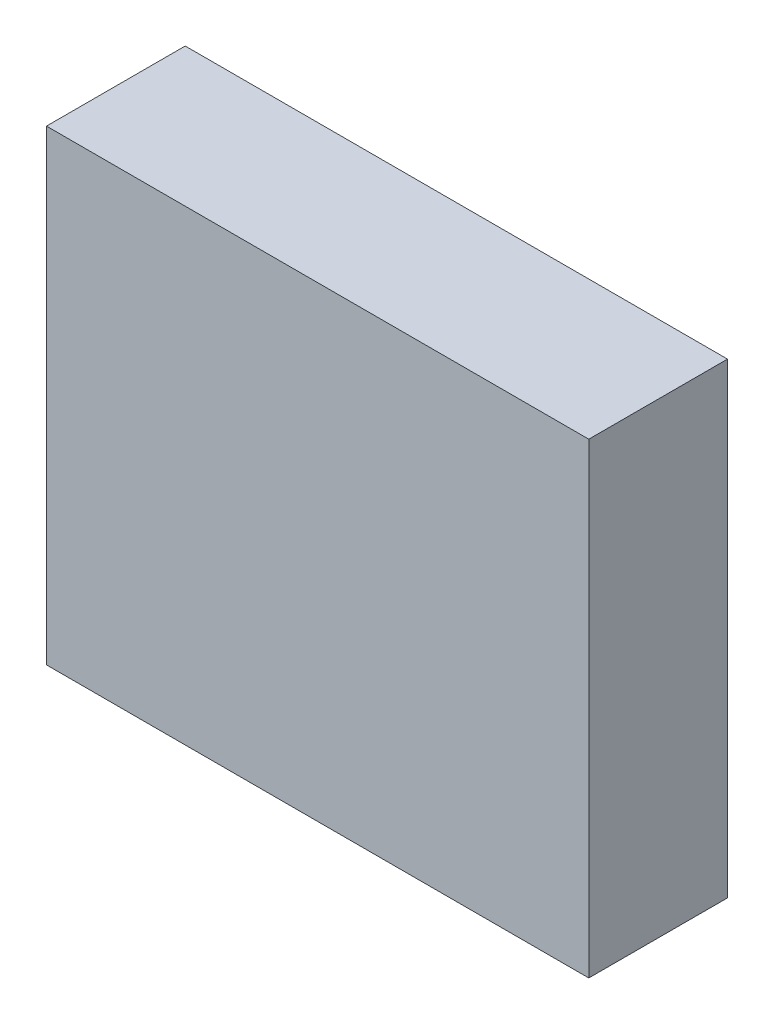
ISO-10303-21;
HEADER;
FILE_DESCRIPTION(('STEP AP214'),'2;1');
FILE_NAME('part.step','',(''),(''),'','','');
FILE_SCHEMA(('AUTOMOTIVE_DESIGN { 1 0 10303 214 1 1 1 1 }'));
ENDSEC;
DATA;
#1=APPLICATION_CONTEXT('core data for automotive mechanical design processes');
#2=APPLICATION_PROTOCOL_DEFINITION('international standard','automotive_design',2000,#1);
#3=PRODUCT_CONTEXT('',#1,'mechanical');
#4=PRODUCT('Part','Part','',(#3));
#5=PRODUCT_RELATED_PRODUCT_CATEGORY('part','',(#4));
#6=PRODUCT_DEFINITION_FORMATION('','',#4);
#7=PRODUCT_DEFINITION_CONTEXT('part definition',#1,'design');
#8=PRODUCT_DEFINITION('design','',#6,#7);
#9=PRODUCT_DEFINITION_SHAPE('','',#8);
#10=(LENGTH_UNIT() NAMED_UNIT(*) SI_UNIT(.MILLI.,.METRE.));
#11=(NAMED_UNIT(*) PLANE_ANGLE_UNIT() SI_UNIT($,.RADIAN.));
#12=(NAMED_UNIT(*) SI_UNIT($,.STERADIAN.) SOLID_ANGLE_UNIT());
#13=UNCERTAINTY_MEASURE_WITH_UNIT(LENGTH_MEASURE(1.E-05),#10,'distance_accuracy_value','');
#14=(GEOMETRIC_REPRESENTATION_CONTEXT(3) GLOBAL_UNCERTAINTY_ASSIGNED_CONTEXT((#13)) GLOBAL_UNIT_ASSIGNED_CONTEXT((#10,
#11,#12)) REPRESENTATION_CONTEXT('',''));
#15=CARTESIAN_POINT('',(0.,0.,0.));
#16=DIRECTION('',(0.,0.,1.));
#17=DIRECTION('',(1.,0.,0.));
#18=AXIS2_PLACEMENT_3D('',#15,#16,#17);
#19=CARTESIAN_POINT('',(-43.,-37.,-22.));
#20=DIRECTION('',(-1.,0.,0.));
#21=DIRECTION('',(0.,0.,1.));
#22=AXIS2_PLACEMENT_3D('',#19,#20,#21);
#23=PLANE('',#22);
#24=DIRECTION('',(0.,-1.,0.));
#25=VECTOR('',#24,1.);
#26=CARTESIAN_POINT('',(-43.,-37.,0.));
#27=LINE('',#26,#25);
#28=CARTESIAN_POINT('',(-43.,37.,0.));
#29=VERTEX_POINT('',#28);
#30=CARTESIAN_POINT('',(-43.,-37.,0.));
#31=VERTEX_POINT('',#30);
#32=EDGE_CURVE('E103',#29,#31,#27,.T.);
#33=ORIENTED_EDGE('',*,*,#32,.F.);
#34=DIRECTION('',(0.,0.,1.));
#35=VECTOR('',#34,1.);
#36=CARTESIAN_POINT('',(-43.,37.,-22.));
#37=LINE('',#36,#35);
#38=CARTESIAN_POINT('',(-43.,37.,-22.));
#39=VERTEX_POINT('',#38);
#40=EDGE_CURVE('E11',#39,#29,#37,.T.);
#41=ORIENTED_EDGE('',*,*,#40,.F.);
#42=DIRECTION('',(0.,-1.,0.));
#43=VECTOR('',#42,1.);
#44=CARTESIAN_POINT('',(-43.,-37.,-22.));
#45=LINE('',#44,#43);
#46=CARTESIAN_POINT('',(-43.,-37.,-22.));
#47=VERTEX_POINT('',#46);
#48=EDGE_CURVE('E97',#39,#47,#45,.T.);
#49=ORIENTED_EDGE('',*,*,#48,.T.);
#50=DIRECTION('',(0.,0.,1.));
#51=VECTOR('',#50,1.);
#52=CARTESIAN_POINT('',(-43.,-37.,-22.));
#53=LINE('',#52,#51);
#54=EDGE_CURVE('E42',#47,#31,#53,.T.);
#55=ORIENTED_EDGE('',*,*,#54,.T.);
#56=EDGE_LOOP('',(#33,#41,#49,#55));
#57=FACE_BOUND('',#56,.T.);
#58=ADVANCED_FACE('F39',(#57),#23,.T.);
#59=CARTESIAN_POINT('',(-43.,37.,-22.));
#60=DIRECTION('',(0.,1.,0.));
#61=DIRECTION('',(0.,0.,1.));
#62=AXIS2_PLACEMENT_3D('',#59,#60,#61);
#63=PLANE('',#62);
#64=DIRECTION('',(-1.,0.,0.));
#65=VECTOR('',#64,1.);
#66=CARTESIAN_POINT('',(-43.,37.,0.));
#67=LINE('',#66,#65);
#68=CARTESIAN_POINT('',(43.,37.,0.));
#69=VERTEX_POINT('',#68);
#70=EDGE_CURVE('E99',#69,#29,#67,.T.);
#71=ORIENTED_EDGE('',*,*,#70,.F.);
#72=DIRECTION('',(0.,0.,1.));
#73=VECTOR('',#72,1.);
#74=CARTESIAN_POINT('',(43.,37.,-22.));
#75=LINE('',#74,#73);
#76=CARTESIAN_POINT('',(43.,37.,-22.));
#77=VERTEX_POINT('',#76);
#78=EDGE_CURVE('E48',#77,#69,#75,.T.);
#79=ORIENTED_EDGE('',*,*,#78,.F.);
#80=DIRECTION('',(-1.,0.,0.));
#81=VECTOR('',#80,1.);
#82=CARTESIAN_POINT('',(-43.,37.,-22.));
#83=LINE('',#82,#81);
#84=EDGE_CURVE('E94',#77,#39,#83,.T.);
#85=ORIENTED_EDGE('',*,*,#84,.T.);
#86=ORIENTED_EDGE('',*,*,#40,.T.);
#87=EDGE_LOOP('',(#71,#79,#85,#86));
#88=FACE_BOUND('',#87,.T.);
#89=ADVANCED_FACE('F113',(#88),#63,.T.);
#90=CARTESIAN_POINT('',(43.,-37.,-22.));
#91=DIRECTION('',(1.,0.,0.));
#92=DIRECTION('',(0.,0.,-1.));
#93=AXIS2_PLACEMENT_3D('',#90,#91,#92);
#94=PLANE('',#93);
#95=DIRECTION('',(0.,1.,0.));
#96=VECTOR('',#95,1.);
#97=CARTESIAN_POINT('',(43.,-37.,0.));
#98=LINE('',#97,#96);
#99=CARTESIAN_POINT('',(43.,-37.,0.));
#100=VERTEX_POINT('',#99);
#101=EDGE_CURVE('E89',#100,#69,#98,.T.);
#102=ORIENTED_EDGE('',*,*,#101,.F.);
#103=DIRECTION('',(0.,0.,1.));
#104=VECTOR('',#103,1.);
#105=CARTESIAN_POINT('',(43.,-37.,-22.));
#106=LINE('',#105,#104);
#107=CARTESIAN_POINT('',(43.,-37.,-22.));
#108=VERTEX_POINT('',#107);
#109=EDGE_CURVE('E84',#108,#100,#106,.T.);
#110=ORIENTED_EDGE('',*,*,#109,.F.);
#111=DIRECTION('',(0.,1.,0.));
#112=VECTOR('',#111,1.);
#113=CARTESIAN_POINT('',(43.,-37.,-22.));
#114=LINE('',#113,#112);
#115=EDGE_CURVE('E87',#108,#77,#114,.T.);
#116=ORIENTED_EDGE('',*,*,#115,.T.);
#117=ORIENTED_EDGE('',*,*,#78,.T.);
#118=EDGE_LOOP('',(#102,#110,#116,#117));
#119=FACE_BOUND('',#118,.T.);
#120=ADVANCED_FACE('F86',(#119),#94,.T.);
#121=CARTESIAN_POINT('',(-43.,-37.,-22.));
#122=DIRECTION('',(0.,-1.,0.));
#123=DIRECTION('',(0.,0.,-1.));
#124=AXIS2_PLACEMENT_3D('',#121,#122,#123);
#125=PLANE('',#124);
#126=DIRECTION('',(1.,0.,0.));
#127=VECTOR('',#126,1.);
#128=CARTESIAN_POINT('',(-43.,-37.,0.));
#129=LINE('',#128,#127);
#130=EDGE_CURVE('E106',#31,#100,#129,.T.);
#131=ORIENTED_EDGE('',*,*,#130,.F.);
#132=ORIENTED_EDGE('',*,*,#54,.F.);
#133=DIRECTION('',(1.,0.,0.));
#134=VECTOR('',#133,1.);
#135=CARTESIAN_POINT('',(-43.,-37.,-22.));
#136=LINE('',#135,#134);
#137=EDGE_CURVE('E93',#47,#108,#136,.T.);
#138=ORIENTED_EDGE('',*,*,#137,.T.);
#139=ORIENTED_EDGE('',*,*,#109,.T.);
#140=EDGE_LOOP('',(#131,#132,#138,#139));
#141=FACE_BOUND('',#140,.T.);
#142=ADVANCED_FACE('F96',(#141),#125,.T.);
#143=CARTESIAN_POINT('',(0.,0.,-22.));
#144=DIRECTION('',(0.,0.,-1.));
#145=DIRECTION('',(-1.,0.,0.));
#146=AXIS2_PLACEMENT_3D('',#143,#144,#145);
#147=PLANE('',#146);
#148=ORIENTED_EDGE('',*,*,#48,.F.);
#149=ORIENTED_EDGE('',*,*,#84,.F.);
#150=ORIENTED_EDGE('',*,*,#115,.F.);
#151=ORIENTED_EDGE('',*,*,#137,.F.);
#152=EDGE_LOOP('',(#148,#149,#150,#151));
#153=FACE_BOUND('',#152,.T.);
#154=ADVANCED_FACE('F92',(#153),#147,.T.);
#155=CARTESIAN_POINT('',(0.,0.,0.));
#156=DIRECTION('',(0.,0.,-1.));
#157=DIRECTION('',(-1.,0.,0.));
#158=AXIS2_PLACEMENT_3D('',#155,#156,#157);
#159=PLANE('',#158);
#160=ORIENTED_EDGE('',*,*,#32,.T.);
#161=ORIENTED_EDGE('',*,*,#130,.T.);
#162=ORIENTED_EDGE('',*,*,#101,.T.);
#163=ORIENTED_EDGE('',*,*,#70,.T.);
#164=EDGE_LOOP('',(#160,#161,#162,#163));
#165=FACE_BOUND('',#164,.T.);
#166=ADVANCED_FACE('F112',(#165),#159,.F.);
#167=CLOSED_SHELL('',(#58,#89,#120,#142,#154,#166));
#168=MANIFOLD_SOLID_BREP('B2',#167);
#169=ADVANCED_BREP_SHAPE_REPRESENTATION('',(#18,#168),#14);
#170=SHAPE_DEFINITION_REPRESENTATION(#9,#169);
ENDSEC;
END-ISO-10303-21;
